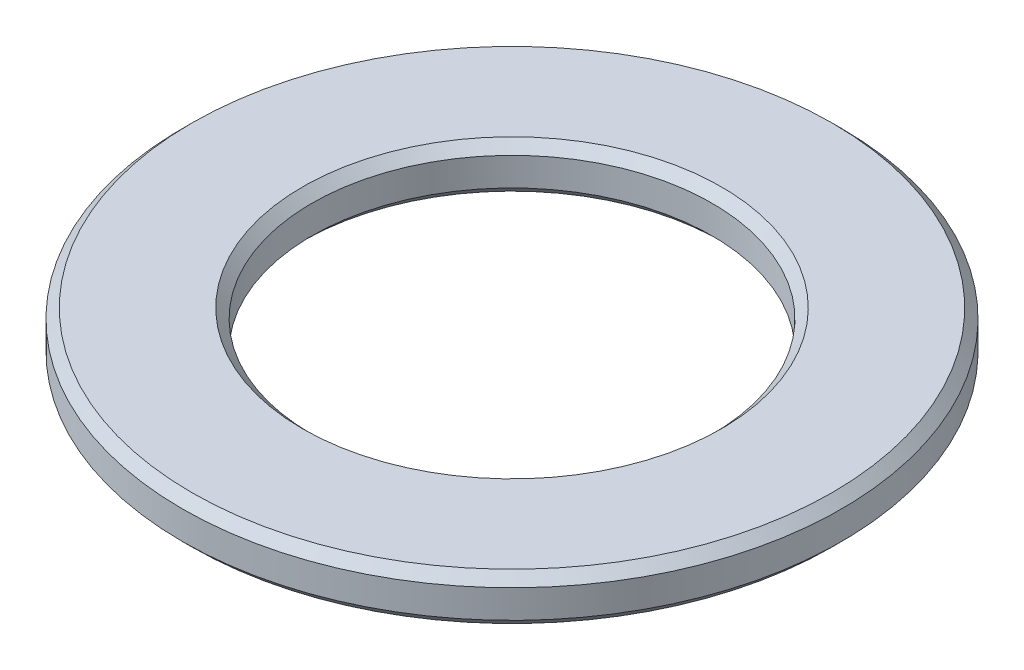
ISO-10303-21;
HEADER;
FILE_DESCRIPTION(('STEP AP214'),'2;1');
FILE_NAME('part.step','',(''),(''),'','','');
FILE_SCHEMA(('AUTOMOTIVE_DESIGN { 1 0 10303 214 1 1 1 1 }'));
ENDSEC;
DATA;
#1=APPLICATION_CONTEXT('core data for automotive mechanical design processes');
#2=APPLICATION_PROTOCOL_DEFINITION('international standard','automotive_design',2000,#1);
#3=PRODUCT_CONTEXT('',#1,'mechanical');
#4=PRODUCT('Part','Part','',(#3));
#5=PRODUCT_RELATED_PRODUCT_CATEGORY('part','',(#4));
#6=PRODUCT_DEFINITION_FORMATION('','',#4);
#7=PRODUCT_DEFINITION_CONTEXT('part definition',#1,'design');
#8=PRODUCT_DEFINITION('design','',#6,#7);
#9=PRODUCT_DEFINITION_SHAPE('','',#8);
#10=(LENGTH_UNIT() NAMED_UNIT(*) SI_UNIT(.MILLI.,.METRE.));
#11=(NAMED_UNIT(*) PLANE_ANGLE_UNIT() SI_UNIT($,.RADIAN.));
#12=(NAMED_UNIT(*) SI_UNIT($,.STERADIAN.) SOLID_ANGLE_UNIT());
#13=UNCERTAINTY_MEASURE_WITH_UNIT(LENGTH_MEASURE(1.E-05),#10,'distance_accuracy_value','');
#14=(GEOMETRIC_REPRESENTATION_CONTEXT(3) GLOBAL_UNCERTAINTY_ASSIGNED_CONTEXT((#13)) GLOBAL_UNIT_ASSIGNED_CONTEXT((#10,
#11,#12)) REPRESENTATION_CONTEXT('',''));
#15=CARTESIAN_POINT('',(0.,0.,0.));
#16=DIRECTION('',(0.,0.,1.));
#17=DIRECTION('',(1.,0.,0.));
#18=AXIS2_PLACEMENT_3D('',#15,#16,#17);
#19=CARTESIAN_POINT('',(0.,1.,0.));
#20=DIRECTION('',(0.,1.,0.));
#21=DIRECTION('',(0.,0.,1.));
#22=AXIS2_PLACEMENT_3D('',#19,#20,#21);
#23=PLANE('',#22);
#24=CARTESIAN_POINT('',(0.,1.,0.));
#25=DIRECTION('',(0.,1.,0.));
#26=DIRECTION('',(0.,0.,1.));
#27=AXIS2_PLACEMENT_3D('',#24,#25,#26);
#28=CIRCLE('',#27,4.45);
#29=CARTESIAN_POINT('',(0.,1.,4.45));
#30=VERTEX_POINT('',#29);
#31=EDGE_CURVE('E10',#30,#30,#28,.F.);
#32=ORIENTED_EDGE('',*,*,#31,.T.);
#33=EDGE_LOOP('',(#32));
#34=FACE_BOUND('',#33,.T.);
#35=CARTESIAN_POINT('',(0.,1.,0.));
#36=DIRECTION('',(0.,1.,0.));
#37=DIRECTION('',(0.,0.,1.));
#38=AXIS2_PLACEMENT_3D('',#35,#36,#37);
#39=CIRCLE('',#38,6.8);
#40=CARTESIAN_POINT('',(0.,1.,6.8));
#41=VERTEX_POINT('',#40);
#42=EDGE_CURVE('E47',#41,#41,#39,.T.);
#43=ORIENTED_EDGE('',*,*,#42,.T.);
#44=EDGE_LOOP('',(#43));
#45=FACE_BOUND('',#44,.T.);
#46=ADVANCED_FACE('F39',(#34,#45),#23,.T.);
#47=CARTESIAN_POINT('',(0.,0.,0.));
#48=DIRECTION('',(0.,1.,0.));
#49=DIRECTION('',(0.,0.,1.));
#50=AXIS2_PLACEMENT_3D('',#47,#48,#49);
#51=PLANE('',#50);
#52=CARTESIAN_POINT('',(0.,0.,0.));
#53=DIRECTION('',(0.,1.,0.));
#54=DIRECTION('',(0.,0.,1.));
#55=AXIS2_PLACEMENT_3D('',#52,#53,#54);
#56=CIRCLE('',#55,4.45);
#57=CARTESIAN_POINT('',(0.,0.,4.45));
#58=VERTEX_POINT('',#57);
#59=EDGE_CURVE('E66',#58,#58,#56,.T.);
#60=ORIENTED_EDGE('',*,*,#59,.T.);
#61=EDGE_LOOP('',(#60));
#62=FACE_BOUND('',#61,.T.);
#63=CARTESIAN_POINT('',(0.,0.,0.));
#64=DIRECTION('',(0.,1.,0.));
#65=DIRECTION('',(0.,0.,1.));
#66=AXIS2_PLACEMENT_3D('',#63,#64,#65);
#67=CIRCLE('',#66,6.8);
#68=CARTESIAN_POINT('',(0.,0.,6.8));
#69=VERTEX_POINT('',#68);
#70=EDGE_CURVE('E69',#69,#69,#67,.F.);
#71=ORIENTED_EDGE('',*,*,#70,.T.);
#72=EDGE_LOOP('',(#71));
#73=FACE_BOUND('',#72,.T.);
#74=ADVANCED_FACE('F73',(#62,#73),#51,.F.);
#75=CARTESIAN_POINT('',(0.,1.,0.));
#76=DIRECTION('',(0.,-1.,0.));
#77=DIRECTION('',(0.,0.,-1.));
#78=AXIS2_PLACEMENT_3D('',#75,#76,#77);
#79=CYLINDRICAL_SURFACE('',#78,7.);
#80=CARTESIAN_POINT('',(0.,0.199999999999999,0.));
#81=DIRECTION('',(0.,1.,0.));
#82=DIRECTION('',(0.,0.,1.));
#83=AXIS2_PLACEMENT_3D('',#80,#81,#82);
#84=CIRCLE('',#83,7.);
#85=CARTESIAN_POINT('',(0.,0.199999999999999,7.));
#86=VERTEX_POINT('',#85);
#87=EDGE_CURVE('E51',#86,#86,#84,.T.);
#88=ORIENTED_EDGE('',*,*,#87,.T.);
#89=EDGE_LOOP('',(#88));
#90=FACE_BOUND('',#89,.T.);
#91=CARTESIAN_POINT('',(0.,0.799999999999998,0.));
#92=DIRECTION('',(0.,1.,0.));
#93=DIRECTION('',(0.,0.,1.));
#94=AXIS2_PLACEMENT_3D('',#91,#92,#93);
#95=CIRCLE('',#94,7.);
#96=CARTESIAN_POINT('',(0.,0.799999999999998,7.));
#97=VERTEX_POINT('',#96);
#98=EDGE_CURVE('E55',#97,#97,#95,.F.);
#99=ORIENTED_EDGE('',*,*,#98,.T.);
#100=EDGE_LOOP('',(#99));
#101=FACE_BOUND('',#100,.T.);
#102=ADVANCED_FACE('F83',(#90,#101),#79,.T.);
#103=CARTESIAN_POINT('',(0.,1.,0.));
#104=DIRECTION('',(0.,-1.,0.));
#105=DIRECTION('',(0.,0.,-1.));
#106=AXIS2_PLACEMENT_3D('',#103,#104,#105);
#107=CYLINDRICAL_SURFACE('',#106,4.25);
#108=CARTESIAN_POINT('',(0.,0.199999999999999,0.));
#109=DIRECTION('',(0.,1.,0.));
#110=DIRECTION('',(0.,0.,1.));
#111=AXIS2_PLACEMENT_3D('',#108,#109,#110);
#112=CIRCLE('',#111,4.25);
#113=CARTESIAN_POINT('',(0.,0.199999999999999,4.25));
#114=VERTEX_POINT('',#113);
#115=EDGE_CURVE('E60',#114,#114,#112,.F.);
#116=ORIENTED_EDGE('',*,*,#115,.T.);
#117=EDGE_LOOP('',(#116));
#118=FACE_BOUND('',#117,.T.);
#119=CARTESIAN_POINT('',(0.,0.800000000000002,0.));
#120=DIRECTION('',(0.,1.,0.));
#121=DIRECTION('',(0.,0.,1.));
#122=AXIS2_PLACEMENT_3D('',#119,#120,#121);
#123=CIRCLE('',#122,4.25);
#124=CARTESIAN_POINT('',(0.,0.800000000000002,4.25));
#125=VERTEX_POINT('',#124);
#126=EDGE_CURVE('E63',#125,#125,#123,.T.);
#127=ORIENTED_EDGE('',*,*,#126,.T.);
#128=EDGE_LOOP('',(#127));
#129=FACE_BOUND('',#128,.T.);
#130=ADVANCED_FACE('F86',(#118,#129),#107,.F.);
#131=CARTESIAN_POINT('',(0.,0.,0.));
#132=DIRECTION('',(0.,-1.,0.));
#133=DIRECTION('',(0.,0.,-1.));
#134=AXIS2_PLACEMENT_3D('',#131,#132,#133);
#135=CONICAL_SURFACE('',#134,4.45,0.785398163397444);
#136=ORIENTED_EDGE('',*,*,#115,.F.);
#137=EDGE_LOOP('',(#136));
#138=FACE_BOUND('',#137,.T.);
#139=ORIENTED_EDGE('',*,*,#59,.F.);
#140=EDGE_LOOP('',(#139));
#141=FACE_BOUND('',#140,.T.);
#142=ADVANCED_FACE('F79',(#138,#141),#135,.F.);
#143=CARTESIAN_POINT('',(0.,0.199999999999999,0.));
#144=DIRECTION('',(0.,1.,0.));
#145=DIRECTION('',(0.,0.,1.));
#146=AXIS2_PLACEMENT_3D('',#143,#144,#145);
#147=CONICAL_SURFACE('',#146,7.,0.78539816339745);
#148=ORIENTED_EDGE('',*,*,#70,.F.);
#149=EDGE_LOOP('',(#148));
#150=FACE_BOUND('',#149,.T.);
#151=ORIENTED_EDGE('',*,*,#87,.F.);
#152=EDGE_LOOP('',(#151));
#153=FACE_BOUND('',#152,.T.);
#154=ADVANCED_FACE('F75',(#150,#153),#147,.T.);
#155=CARTESIAN_POINT('',(0.,0.800000000000002,0.));
#156=DIRECTION('',(0.,1.,0.));
#157=DIRECTION('',(0.,0.,1.));
#158=AXIS2_PLACEMENT_3D('',#155,#156,#157);
#159=CONICAL_SURFACE('',#158,4.25,0.785398163397442);
#160=ORIENTED_EDGE('',*,*,#31,.F.);
#161=EDGE_LOOP('',(#160));
#162=FACE_BOUND('',#161,.T.);
#163=ORIENTED_EDGE('',*,*,#126,.F.);
#164=EDGE_LOOP('',(#163));
#165=FACE_BOUND('',#164,.T.);
#166=ADVANCED_FACE('F78',(#162,#165),#159,.F.);
#167=CARTESIAN_POINT('',(0.,1.,0.));
#168=DIRECTION('',(0.,-1.,0.));
#169=DIRECTION('',(0.,0.,-1.));
#170=AXIS2_PLACEMENT_3D('',#167,#168,#169);
#171=CONICAL_SURFACE('',#170,6.8,0.785398163397442);
#172=ORIENTED_EDGE('',*,*,#98,.F.);
#173=EDGE_LOOP('',(#172));
#174=FACE_BOUND('',#173,.T.);
#175=ORIENTED_EDGE('',*,*,#42,.F.);
#176=EDGE_LOOP('',(#175));
#177=FACE_BOUND('',#176,.T.);
#178=ADVANCED_FACE('F42',(#174,#177),#171,.T.);
#179=CLOSED_SHELL('',(#46,#74,#102,#130,#142,#154,#166,#178));
#180=MANIFOLD_SOLID_BREP('B2',#179);
#181=ADVANCED_BREP_SHAPE_REPRESENTATION('',(#18,#180),#14);
#182=SHAPE_DEFINITION_REPRESENTATION(#9,#181);
ENDSEC;
END-ISO-10303-21;
